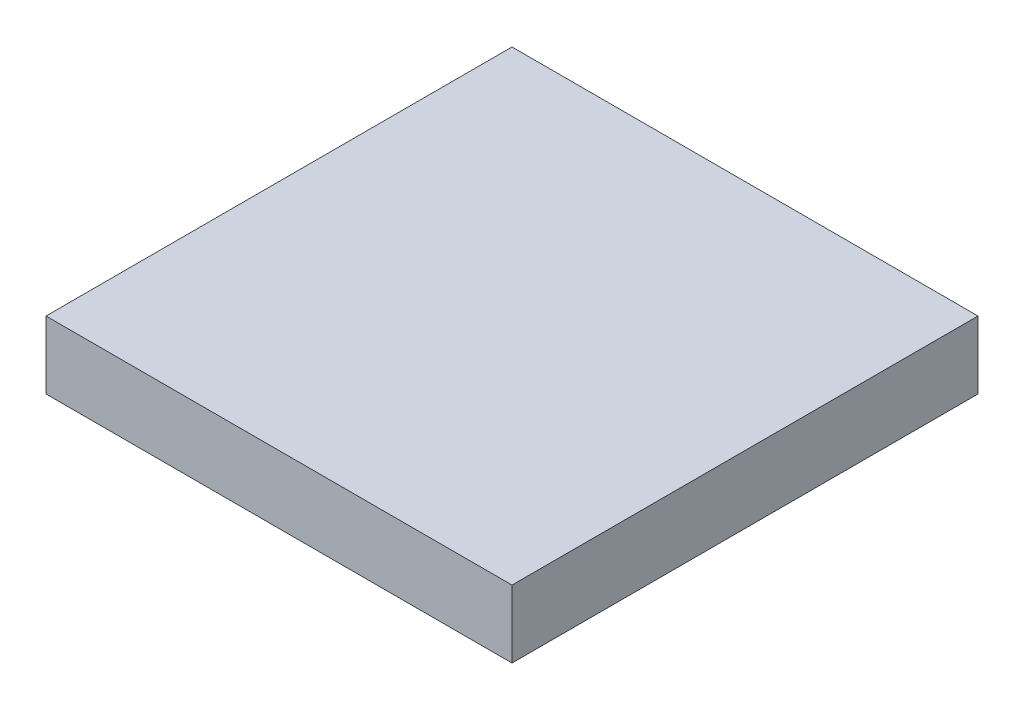
ISO-10303-21;
HEADER;
FILE_DESCRIPTION(('STEP AP214'),'2;1');
FILE_NAME('part.step','',(''),(''),'','','');
FILE_SCHEMA(('AUTOMOTIVE_DESIGN { 1 0 10303 214 1 1 1 1 }'));
ENDSEC;
DATA;
#1=APPLICATION_CONTEXT('core data for automotive mechanical design processes');
#2=APPLICATION_PROTOCOL_DEFINITION('international standard','automotive_design',2000,#1);
#3=PRODUCT_CONTEXT('',#1,'mechanical');
#4=PRODUCT('Part','Part','',(#3));
#5=PRODUCT_RELATED_PRODUCT_CATEGORY('part','',(#4));
#6=PRODUCT_DEFINITION_FORMATION('','',#4);
#7=PRODUCT_DEFINITION_CONTEXT('part definition',#1,'design');
#8=PRODUCT_DEFINITION('design','',#6,#7);
#9=PRODUCT_DEFINITION_SHAPE('','',#8);
#10=(LENGTH_UNIT() NAMED_UNIT(*) SI_UNIT(.MILLI.,.METRE.));
#11=(NAMED_UNIT(*) PLANE_ANGLE_UNIT() SI_UNIT($,.RADIAN.));
#12=(NAMED_UNIT(*) SI_UNIT($,.STERADIAN.) SOLID_ANGLE_UNIT());
#13=UNCERTAINTY_MEASURE_WITH_UNIT(LENGTH_MEASURE(1.E-05),#10,'distance_accuracy_value','');
#14=(GEOMETRIC_REPRESENTATION_CONTEXT(3) GLOBAL_UNCERTAINTY_ASSIGNED_CONTEXT((#13)) GLOBAL_UNIT_ASSIGNED_CONTEXT((#10,
#11,#12)) REPRESENTATION_CONTEXT('',''));
#15=CARTESIAN_POINT('',(0.,0.,0.));
#16=DIRECTION('',(0.,0.,1.));
#17=DIRECTION('',(1.,0.,0.));
#18=AXIS2_PLACEMENT_3D('',#15,#16,#17);
#19=CARTESIAN_POINT('',(0.,5.08,0.));
#20=DIRECTION('',(-1.,0.,0.));
#21=DIRECTION('',(0.,0.,1.));
#22=AXIS2_PLACEMENT_3D('',#19,#20,#21);
#23=PLANE('',#22);
#24=DIRECTION('',(0.,0.,-1.));
#25=VECTOR('',#24,1.);
#26=CARTESIAN_POINT('',(0.,0.,0.));
#27=LINE('',#26,#25);
#28=CARTESIAN_POINT('',(0.,0.,0.));
#29=VERTEX_POINT('',#28);
#30=CARTESIAN_POINT('',(0.,0.,-35.052));
#31=VERTEX_POINT('',#30);
#32=EDGE_CURVE('E101',#29,#31,#27,.T.);
#33=ORIENTED_EDGE('',*,*,#32,.F.);
#34=DIRECTION('',(0.,-1.,0.));
#35=VECTOR('',#34,1.);
#36=CARTESIAN_POINT('',(0.,5.08,0.));
#37=LINE('',#36,#35);
#38=CARTESIAN_POINT('',(0.,5.08,0.));
#39=VERTEX_POINT('',#38);
#40=EDGE_CURVE('E11',#39,#29,#37,.T.);
#41=ORIENTED_EDGE('',*,*,#40,.F.);
#42=DIRECTION('',(0.,0.,-1.));
#43=VECTOR('',#42,1.);
#44=CARTESIAN_POINT('',(0.,5.08,0.));
#45=LINE('',#44,#43);
#46=CARTESIAN_POINT('',(0.,5.08,-35.052));
#47=VERTEX_POINT('',#46);
#48=EDGE_CURVE('E96',#39,#47,#45,.T.);
#49=ORIENTED_EDGE('',*,*,#48,.T.);
#50=DIRECTION('',(0.,-1.,0.));
#51=VECTOR('',#50,1.);
#52=CARTESIAN_POINT('',(0.,5.08,-35.052));
#53=LINE('',#52,#51);
#54=EDGE_CURVE('E39',#47,#31,#53,.T.);
#55=ORIENTED_EDGE('',*,*,#54,.T.);
#56=EDGE_LOOP('',(#33,#41,#49,#55));
#57=FACE_BOUND('',#56,.T.);
#58=ADVANCED_FACE('F36',(#57),#23,.T.);
#59=CARTESIAN_POINT('',(0.,5.08,0.));
#60=DIRECTION('',(0.,0.,-1.));
#61=DIRECTION('',(-1.,0.,0.));
#62=AXIS2_PLACEMENT_3D('',#59,#60,#61);
#63=PLANE('',#62);
#64=DIRECTION('',(1.,0.,0.));
#65=VECTOR('',#64,1.);
#66=CARTESIAN_POINT('',(0.,0.,0.));
#67=LINE('',#66,#65);
#68=CARTESIAN_POINT('',(35.052,0.,0.));
#69=VERTEX_POINT('',#68);
#70=EDGE_CURVE('E69',#29,#69,#67,.T.);
#71=ORIENTED_EDGE('',*,*,#70,.T.);
#72=DIRECTION('',(0.,-1.,0.));
#73=VECTOR('',#72,1.);
#74=CARTESIAN_POINT('',(35.052,5.08,0.));
#75=LINE('',#74,#73);
#76=CARTESIAN_POINT('',(35.052,5.08,0.));
#77=VERTEX_POINT('',#76);
#78=EDGE_CURVE('E45',#77,#69,#75,.T.);
#79=ORIENTED_EDGE('',*,*,#78,.F.);
#80=DIRECTION('',(1.,0.,0.));
#81=VECTOR('',#80,1.);
#82=CARTESIAN_POINT('',(0.,5.08,0.));
#83=LINE('',#82,#81);
#84=EDGE_CURVE('E86',#39,#77,#83,.T.);
#85=ORIENTED_EDGE('',*,*,#84,.F.);
#86=ORIENTED_EDGE('',*,*,#40,.T.);
#87=EDGE_LOOP('',(#71,#79,#85,#86));
#88=FACE_BOUND('',#87,.T.);
#89=ADVANCED_FACE('F111',(#88),#63,.F.);
#90=CARTESIAN_POINT('',(35.052,5.08,0.));
#91=DIRECTION('',(-1.,0.,0.));
#92=DIRECTION('',(0.,0.,1.));
#93=AXIS2_PLACEMENT_3D('',#90,#91,#92);
#94=PLANE('',#93);
#95=DIRECTION('',(0.,0.,-1.));
#96=VECTOR('',#95,1.);
#97=CARTESIAN_POINT('',(35.052,0.,0.));
#98=LINE('',#97,#96);
#99=CARTESIAN_POINT('',(35.052,0.,-35.052));
#100=VERTEX_POINT('',#99);
#101=EDGE_CURVE('E93',#69,#100,#98,.T.);
#102=ORIENTED_EDGE('',*,*,#101,.T.);
#103=DIRECTION('',(0.,-1.,0.));
#104=VECTOR('',#103,1.);
#105=CARTESIAN_POINT('',(35.052,5.08,-35.052));
#106=LINE('',#105,#104);
#107=CARTESIAN_POINT('',(35.052,5.08,-35.052));
#108=VERTEX_POINT('',#107);
#109=EDGE_CURVE('E90',#108,#100,#106,.T.);
#110=ORIENTED_EDGE('',*,*,#109,.F.);
#111=DIRECTION('',(0.,0.,-1.));
#112=VECTOR('',#111,1.);
#113=CARTESIAN_POINT('',(35.052,5.08,0.));
#114=LINE('',#113,#112);
#115=EDGE_CURVE('E81',#77,#108,#114,.T.);
#116=ORIENTED_EDGE('',*,*,#115,.F.);
#117=ORIENTED_EDGE('',*,*,#78,.T.);
#118=EDGE_LOOP('',(#102,#110,#116,#117));
#119=FACE_BOUND('',#118,.T.);
#120=ADVANCED_FACE('F91',(#119),#94,.F.);
#121=CARTESIAN_POINT('',(0.,5.08,-35.052));
#122=DIRECTION('',(0.,0.,-1.));
#123=DIRECTION('',(-1.,0.,0.));
#124=AXIS2_PLACEMENT_3D('',#121,#122,#123);
#125=PLANE('',#124);
#126=DIRECTION('',(1.,0.,0.));
#127=VECTOR('',#126,1.);
#128=CARTESIAN_POINT('',(0.,0.,-35.052));
#129=LINE('',#128,#127);
#130=EDGE_CURVE('E104',#31,#100,#129,.T.);
#131=ORIENTED_EDGE('',*,*,#130,.F.);
#132=ORIENTED_EDGE('',*,*,#54,.F.);
#133=DIRECTION('',(1.,0.,0.));
#134=VECTOR('',#133,1.);
#135=CARTESIAN_POINT('',(0.,5.08,-35.052));
#136=LINE('',#135,#134);
#137=EDGE_CURVE('E85',#47,#108,#136,.T.);
#138=ORIENTED_EDGE('',*,*,#137,.T.);
#139=ORIENTED_EDGE('',*,*,#109,.T.);
#140=EDGE_LOOP('',(#131,#132,#138,#139));
#141=FACE_BOUND('',#140,.T.);
#142=ADVANCED_FACE('F95',(#141),#125,.T.);
#143=CARTESIAN_POINT('',(0.,5.08,0.));
#144=DIRECTION('',(0.,-1.,0.));
#145=DIRECTION('',(0.,0.,-1.));
#146=AXIS2_PLACEMENT_3D('',#143,#144,#145);
#147=PLANE('',#146);
#148=ORIENTED_EDGE('',*,*,#48,.F.);
#149=ORIENTED_EDGE('',*,*,#84,.T.);
#150=ORIENTED_EDGE('',*,*,#115,.T.);
#151=ORIENTED_EDGE('',*,*,#137,.F.);
#152=EDGE_LOOP('',(#148,#149,#150,#151));
#153=FACE_BOUND('',#152,.T.);
#154=ADVANCED_FACE('F84',(#153),#147,.F.);
#155=CARTESIAN_POINT('',(0.,0.,0.));
#156=DIRECTION('',(0.,-1.,0.));
#157=DIRECTION('',(0.,0.,-1.));
#158=AXIS2_PLACEMENT_3D('',#155,#156,#157);
#159=PLANE('',#158);
#160=ORIENTED_EDGE('',*,*,#32,.T.);
#161=ORIENTED_EDGE('',*,*,#130,.T.);
#162=ORIENTED_EDGE('',*,*,#101,.F.);
#163=ORIENTED_EDGE('',*,*,#70,.F.);
#164=EDGE_LOOP('',(#160,#161,#162,#163));
#165=FACE_BOUND('',#164,.T.);
#166=ADVANCED_FACE('F109',(#165),#159,.T.);
#167=CLOSED_SHELL('',(#58,#89,#120,#142,#154,#166));
#168=MANIFOLD_SOLID_BREP('B2',#167);
#169=ADVANCED_BREP_SHAPE_REPRESENTATION('',(#18,#168),#14);
#170=SHAPE_DEFINITION_REPRESENTATION(#9,#169);
ENDSEC;
END-ISO-10303-21;
